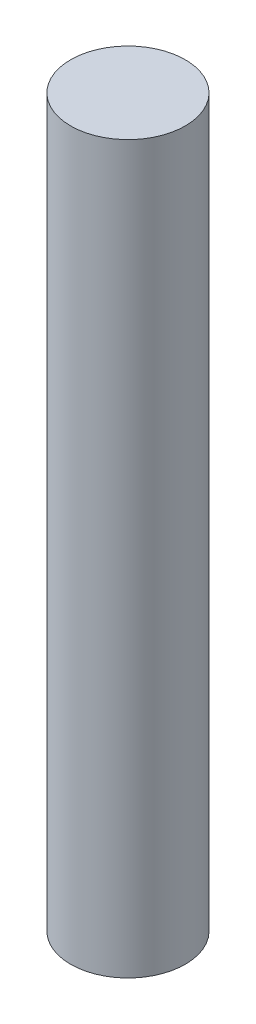
ISO-10303-21;
HEADER;
FILE_DESCRIPTION(('STEP AP214'),'2;1');
FILE_NAME('part.step','',(''),(''),'','','');
FILE_SCHEMA(('AUTOMOTIVE_DESIGN { 1 0 10303 214 1 1 1 1 }'));
ENDSEC;
DATA;
#1=APPLICATION_CONTEXT('core data for automotive mechanical design processes');
#2=APPLICATION_PROTOCOL_DEFINITION('international standard','automotive_design',2000,#1);
#3=PRODUCT_CONTEXT('',#1,'mechanical');
#4=PRODUCT('Part','Part','',(#3));
#5=PRODUCT_RELATED_PRODUCT_CATEGORY('part','',(#4));
#6=PRODUCT_DEFINITION_FORMATION('','',#4);
#7=PRODUCT_DEFINITION_CONTEXT('part definition',#1,'design');
#8=PRODUCT_DEFINITION('design','',#6,#7);
#9=PRODUCT_DEFINITION_SHAPE('','',#8);
#10=(LENGTH_UNIT() NAMED_UNIT(*) SI_UNIT(.MILLI.,.METRE.));
#11=(NAMED_UNIT(*) PLANE_ANGLE_UNIT() SI_UNIT($,.RADIAN.));
#12=(NAMED_UNIT(*) SI_UNIT($,.STERADIAN.) SOLID_ANGLE_UNIT());
#13=UNCERTAINTY_MEASURE_WITH_UNIT(LENGTH_MEASURE(1.E-05),#10,'distance_accuracy_value','');
#14=(GEOMETRIC_REPRESENTATION_CONTEXT(3) GLOBAL_UNCERTAINTY_ASSIGNED_CONTEXT((#13)) GLOBAL_UNIT_ASSIGNED_CONTEXT((#10,
#11,#12)) REPRESENTATION_CONTEXT('',''));
#15=CARTESIAN_POINT('',(0.,0.,0.));
#16=DIRECTION('',(0.,0.,1.));
#17=DIRECTION('',(1.,0.,0.));
#18=AXIS2_PLACEMENT_3D('',#15,#16,#17);
#19=CARTESIAN_POINT('',(0.,500.,0.));
#20=DIRECTION('',(0.,-1.,0.));
#21=DIRECTION('',(0.,0.,-1.));
#22=AXIS2_PLACEMENT_3D('',#19,#20,#21);
#23=CYLINDRICAL_SURFACE('',#22,39.49);
#24=CARTESIAN_POINT('',(0.,500.,0.));
#25=DIRECTION('',(0.,1.,0.));
#26=DIRECTION('',(0.,0.,1.));
#27=AXIS2_PLACEMENT_3D('',#24,#25,#26);
#28=CIRCLE('',#27,39.49);
#29=CARTESIAN_POINT('',(0.,500.,39.49));
#30=VERTEX_POINT('',#29);
#31=EDGE_CURVE('E10',#30,#30,#28,.T.);
#32=ORIENTED_EDGE('',*,*,#31,.F.);
#33=EDGE_LOOP('',(#32));
#34=FACE_BOUND('',#33,.T.);
#35=CARTESIAN_POINT('',(0.,0.,0.));
#36=DIRECTION('',(0.,1.,0.));
#37=DIRECTION('',(0.,0.,1.));
#38=AXIS2_PLACEMENT_3D('',#35,#36,#37);
#39=CIRCLE('',#38,39.49);
#40=CARTESIAN_POINT('',(0.,0.,39.49));
#41=VERTEX_POINT('',#40);
#42=EDGE_CURVE('E40',#41,#41,#39,.T.);
#43=ORIENTED_EDGE('',*,*,#42,.T.);
#44=EDGE_LOOP('',(#43));
#45=FACE_BOUND('',#44,.T.);
#46=ADVANCED_FACE('F37',(#34,#45),#23,.T.);
#47=CARTESIAN_POINT('',(0.,500.,0.));
#48=DIRECTION('',(0.,1.,0.));
#49=DIRECTION('',(0.,0.,1.));
#50=AXIS2_PLACEMENT_3D('',#47,#48,#49);
#51=PLANE('',#50);
#52=ORIENTED_EDGE('',*,*,#31,.T.);
#53=EDGE_LOOP('',(#52));
#54=FACE_BOUND('',#53,.T.);
#55=ADVANCED_FACE('F54',(#54),#51,.T.);
#56=CARTESIAN_POINT('',(0.,0.,0.));
#57=DIRECTION('',(0.,1.,0.));
#58=DIRECTION('',(0.,0.,1.));
#59=AXIS2_PLACEMENT_3D('',#56,#57,#58);
#60=PLANE('',#59);
#61=ORIENTED_EDGE('',*,*,#42,.F.);
#62=EDGE_LOOP('',(#61));
#63=FACE_BOUND('',#62,.T.);
#64=ADVANCED_FACE('F52',(#63),#60,.F.);
#65=CLOSED_SHELL('',(#46,#55,#64));
#66=MANIFOLD_SOLID_BREP('B2',#65);
#67=ADVANCED_BREP_SHAPE_REPRESENTATION('',(#18,#66),#14);
#68=SHAPE_DEFINITION_REPRESENTATION(#9,#67);
ENDSEC;
END-ISO-10303-21;
